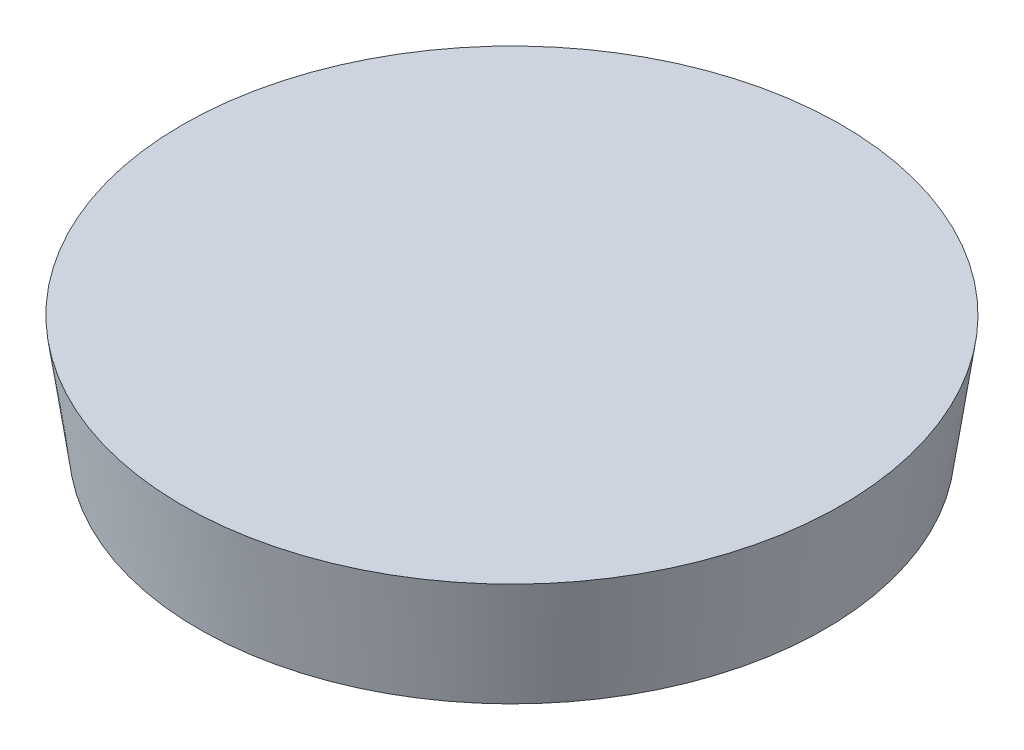
ISO-10303-21;
HEADER;
FILE_DESCRIPTION(('STEP AP214'),'2;1');
FILE_NAME('part.step','',(''),(''),'','','');
FILE_SCHEMA(('AUTOMOTIVE_DESIGN { 1 0 10303 214 1 1 1 1 }'));
ENDSEC;
DATA;
#1=APPLICATION_CONTEXT('core data for automotive mechanical design processes');
#2=APPLICATION_PROTOCOL_DEFINITION('international standard','automotive_design',2000,#1);
#3=PRODUCT_CONTEXT('',#1,'mechanical');
#4=PRODUCT('Part','Part','',(#3));
#5=PRODUCT_RELATED_PRODUCT_CATEGORY('part','',(#4));
#6=PRODUCT_DEFINITION_FORMATION('','',#4);
#7=PRODUCT_DEFINITION_CONTEXT('part definition',#1,'design');
#8=PRODUCT_DEFINITION('design','',#6,#7);
#9=PRODUCT_DEFINITION_SHAPE('','',#8);
#10=(LENGTH_UNIT() NAMED_UNIT(*) SI_UNIT(.MILLI.,.METRE.));
#11=(NAMED_UNIT(*) PLANE_ANGLE_UNIT() SI_UNIT($,.RADIAN.));
#12=(NAMED_UNIT(*) SI_UNIT($,.STERADIAN.) SOLID_ANGLE_UNIT());
#13=UNCERTAINTY_MEASURE_WITH_UNIT(LENGTH_MEASURE(1.E-05),#10,'distance_accuracy_value','');
#14=(GEOMETRIC_REPRESENTATION_CONTEXT(3) GLOBAL_UNCERTAINTY_ASSIGNED_CONTEXT((#13)) GLOBAL_UNIT_ASSIGNED_CONTEXT((#10,
#11,#12)) REPRESENTATION_CONTEXT('',''));
#15=CARTESIAN_POINT('',(0.,0.,0.));
#16=DIRECTION('',(0.,0.,1.));
#17=DIRECTION('',(1.,0.,0.));
#18=AXIS2_PLACEMENT_3D('',#15,#16,#17);
#19=CARTESIAN_POINT('',(0.,0.,0.));
#20=DIRECTION('',(0.,1.,0.));
#21=DIRECTION('',(-1.,0.,0.));
#22=AXIS2_PLACEMENT_3D('',#19,#20,#21);
#23=PLANE('',#22);
#24=CARTESIAN_POINT('',(0.,0.,0.));
#25=DIRECTION('',(0.,-1.,0.));
#26=DIRECTION('',(1.,0.,0.));
#27=AXIS2_PLACEMENT_3D('',#24,#25,#26);
#28=CIRCLE('',#27,4.);
#29=CARTESIAN_POINT('',(4.,0.,0.));
#30=VERTEX_POINT('',#29);
#31=EDGE_CURVE('E10',#30,#30,#28,.T.);
#32=ORIENTED_EDGE('',*,*,#31,.F.);
#33=EDGE_LOOP('',(#32));
#34=FACE_BOUND('',#33,.T.);
#35=CARTESIAN_POINT('',(0.,0.,0.));
#36=DIRECTION('',(0.,1.,0.));
#37=DIRECTION('',(-1.,0.,0.));
#38=AXIS2_PLACEMENT_3D('',#35,#36,#37);
#39=CIRCLE('',#38,9.5);
#40=CARTESIAN_POINT('',(-9.5,0.,0.));
#41=VERTEX_POINT('',#40);
#42=EDGE_CURVE('E34',#41,#41,#39,.T.);
#43=ORIENTED_EDGE('',*,*,#42,.F.);
#44=EDGE_LOOP('',(#43));
#45=FACE_BOUND('',#44,.T.);
#46=ADVANCED_FACE('F31',(#34,#45),#23,.F.);
#47=CARTESIAN_POINT('',(0.,0.,0.));
#48=DIRECTION('',(0.,1.,0.));
#49=DIRECTION('',(-1.,0.,0.));
#50=AXIS2_PLACEMENT_3D('',#47,#48,#49);
#51=CONICAL_SURFACE('',#50,9.5,0.141897054604164);
#52=CARTESIAN_POINT('',(0.,3.5,0.));
#53=DIRECTION('',(0.,1.,0.));
#54=DIRECTION('',(-1.,0.,0.));
#55=AXIS2_PLACEMENT_3D('',#52,#53,#54);
#56=CIRCLE('',#55,10.);
#57=CARTESIAN_POINT('',(-10.,3.5,0.));
#58=VERTEX_POINT('',#57);
#59=EDGE_CURVE('E42',#58,#58,#56,.T.);
#60=ORIENTED_EDGE('',*,*,#59,.F.);
#61=EDGE_LOOP('',(#60));
#62=FACE_BOUND('',#61,.T.);
#63=ORIENTED_EDGE('',*,*,#42,.T.);
#64=EDGE_LOOP('',(#63));
#65=FACE_BOUND('',#64,.T.);
#66=ADVANCED_FACE('F62',(#62,#65),#51,.T.);
#67=CARTESIAN_POINT('',(10.,3.5,0.));
#68=DIRECTION('',(0.,-1.,0.));
#69=DIRECTION('',(1.,0.,0.));
#70=AXIS2_PLACEMENT_3D('',#67,#68,#69);
#71=PLANE('',#70);
#72=ORIENTED_EDGE('',*,*,#59,.T.);
#73=EDGE_LOOP('',(#72));
#74=FACE_BOUND('',#73,.T.);
#75=ADVANCED_FACE('F55',(#74),#71,.F.);
#76=CARTESIAN_POINT('',(0.,-1.2,0.));
#77=DIRECTION('',(0.,1.,0.));
#78=DIRECTION('',(-1.,0.,0.));
#79=AXIS2_PLACEMENT_3D('',#76,#77,#78);
#80=CYLINDRICAL_SURFACE('',#79,4.);
#81=CARTESIAN_POINT('',(0.,-1.2,0.));
#82=DIRECTION('',(0.,-1.,0.));
#83=DIRECTION('',(1.,0.,0.));
#84=AXIS2_PLACEMENT_3D('',#81,#82,#83);
#85=CIRCLE('',#84,4.);
#86=CARTESIAN_POINT('',(4.,-1.2,0.));
#87=VERTEX_POINT('',#86);
#88=EDGE_CURVE('E44',#87,#87,#85,.T.);
#89=ORIENTED_EDGE('',*,*,#88,.F.);
#90=EDGE_LOOP('',(#89));
#91=FACE_BOUND('',#90,.T.);
#92=ORIENTED_EDGE('',*,*,#31,.T.);
#93=EDGE_LOOP('',(#92));
#94=FACE_BOUND('',#93,.T.);
#95=ADVANCED_FACE('F53',(#91,#94),#80,.T.);
#96=CARTESIAN_POINT('',(0.,-1.2,0.));
#97=DIRECTION('',(0.,-1.,0.));
#98=DIRECTION('',(1.,0.,0.));
#99=AXIS2_PLACEMENT_3D('',#96,#97,#98);
#100=PLANE('',#99);
#101=ORIENTED_EDGE('',*,*,#88,.T.);
#102=EDGE_LOOP('',(#101));
#103=FACE_BOUND('',#102,.T.);
#104=ADVANCED_FACE('F51',(#103),#100,.T.);
#105=CLOSED_SHELL('',(#46,#66,#75,#95,#104));
#106=MANIFOLD_SOLID_BREP('B2',#105);
#107=ADVANCED_BREP_SHAPE_REPRESENTATION('',(#18,#106),#14);
#108=SHAPE_DEFINITION_REPRESENTATION(#9,#107);
ENDSEC;
END-ISO-10303-21;
